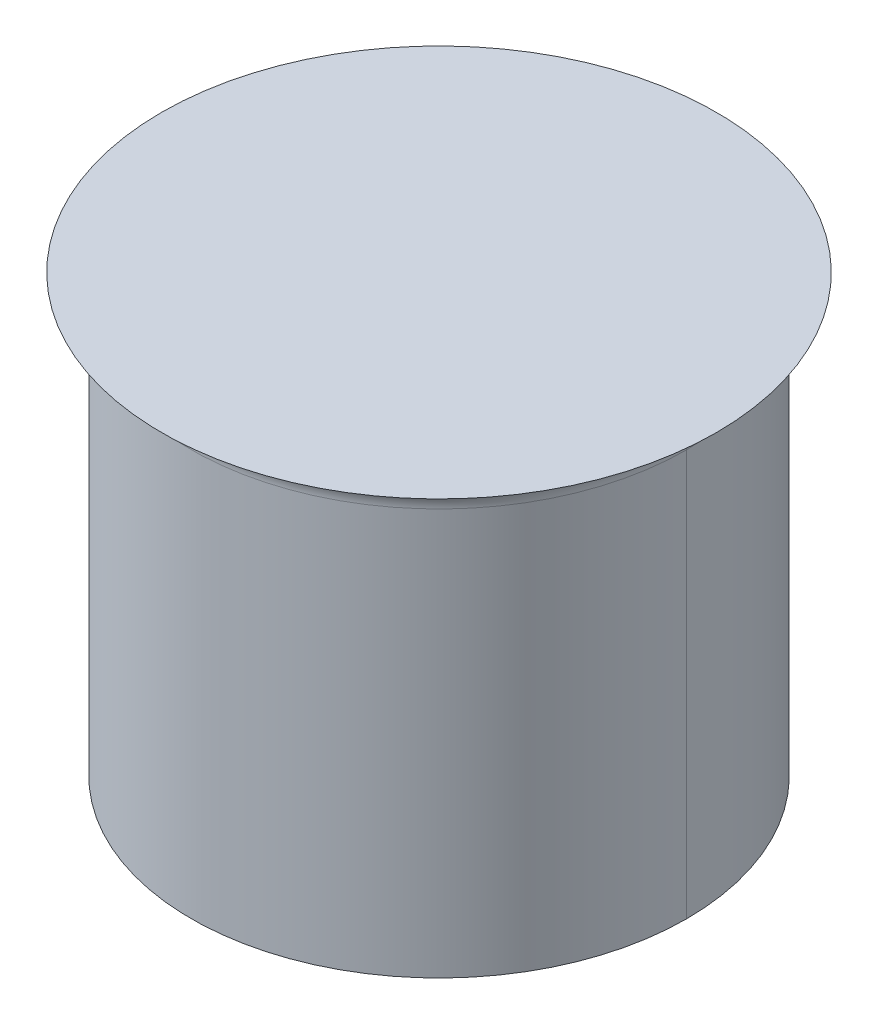
ISO-10303-21;
HEADER;
FILE_DESCRIPTION(('STEP AP214'),'2;1');
FILE_NAME('part.step','',(''),(''),'','','');
FILE_SCHEMA(('AUTOMOTIVE_DESIGN { 1 0 10303 214 1 1 1 1 }'));
ENDSEC;
DATA;
#1=APPLICATION_CONTEXT('core data for automotive mechanical design processes');
#2=APPLICATION_PROTOCOL_DEFINITION('international standard','automotive_design',2000,#1);
#3=PRODUCT_CONTEXT('',#1,'mechanical');
#4=PRODUCT('Part','Part','',(#3));
#5=PRODUCT_RELATED_PRODUCT_CATEGORY('part','',(#4));
#6=PRODUCT_DEFINITION_FORMATION('','',#4);
#7=PRODUCT_DEFINITION_CONTEXT('part definition',#1,'design');
#8=PRODUCT_DEFINITION('design','',#6,#7);
#9=PRODUCT_DEFINITION_SHAPE('','',#8);
#10=(LENGTH_UNIT() NAMED_UNIT(*) SI_UNIT(.MILLI.,.METRE.));
#11=(NAMED_UNIT(*) PLANE_ANGLE_UNIT() SI_UNIT($,.RADIAN.));
#12=(NAMED_UNIT(*) SI_UNIT($,.STERADIAN.) SOLID_ANGLE_UNIT());
#13=UNCERTAINTY_MEASURE_WITH_UNIT(LENGTH_MEASURE(1.E-05),#10,'distance_accuracy_value','');
#14=(GEOMETRIC_REPRESENTATION_CONTEXT(3) GLOBAL_UNCERTAINTY_ASSIGNED_CONTEXT((#13)) GLOBAL_UNIT_ASSIGNED_CONTEXT((#10,
#11,#12)) REPRESENTATION_CONTEXT('',''));
#15=CARTESIAN_POINT('',(0.,0.,0.));
#16=DIRECTION('',(0.,0.,1.));
#17=DIRECTION('',(1.,0.,0.));
#18=AXIS2_PLACEMENT_3D('',#15,#16,#17);
#19=CARTESIAN_POINT('',(0.,-53.3399999999998,0.));
#20=DIRECTION('',(0.,1.,0.));
#21=DIRECTION('',(1.,0.,0.));
#22=AXIS2_PLACEMENT_3D('',#19,#20,#21);
#23=CYLINDRICAL_SURFACE('',#22,12.7);
#24=DIRECTION('',(0.,1.,0.));
#25=VECTOR('',#24,1.);
#26=CARTESIAN_POINT('',(-12.7,-31.1149999999998,0.));
#27=LINE('',#26,#25);
#28=CARTESIAN_POINT('',(-12.7,-22.3519999999998,0.));
#29=VERTEX_POINT('',#28);
#30=CARTESIAN_POINT('',(-12.7,-1.524,0.));
#31=VERTEX_POINT('',#30);
#32=EDGE_CURVE('E61',#29,#31,#27,.T.);
#33=ORIENTED_EDGE('',*,*,#32,.F.);
#34=CARTESIAN_POINT('',(0.,-22.3519999999998,0.));
#35=DIRECTION('',(0.,-1.,0.));
#36=DIRECTION('',(0.,0.,-1.));
#37=AXIS2_PLACEMENT_3D('',#34,#35,#36);
#38=CIRCLE('',#37,12.7);
#39=CARTESIAN_POINT('',(12.7,-22.3519999999998,0.));
#40=VERTEX_POINT('',#39);
#41=EDGE_CURVE('E55',#29,#40,#38,.F.);
#42=ORIENTED_EDGE('',*,*,#41,.T.);
#43=DIRECTION('',(0.,1.,0.));
#44=VECTOR('',#43,1.);
#45=CARTESIAN_POINT('',(12.7,-31.1149999999998,0.));
#46=LINE('',#45,#44);
#47=CARTESIAN_POINT('',(12.7,-1.524,0.));
#48=VERTEX_POINT('',#47);
#49=EDGE_CURVE('E49',#40,#48,#46,.T.);
#50=ORIENTED_EDGE('',*,*,#49,.T.);
#51=CARTESIAN_POINT('',(0.,-1.52399999999998,0.));
#52=DIRECTION('',(0.,-1.,0.));
#53=DIRECTION('',(1.,0.,0.));
#54=AXIS2_PLACEMENT_3D('',#51,#52,#53);
#55=CIRCLE('',#54,12.7);
#56=EDGE_CURVE('E95',#48,#31,#55,.T.);
#57=ORIENTED_EDGE('',*,*,#56,.T.);
#58=EDGE_LOOP('',(#33,#42,#50,#57));
#59=FACE_BOUND('',#58,.T.);
#60=ADVANCED_FACE('F41',(#59),#23,.T.);
#61=CARTESIAN_POINT('',(0.,-53.3399999999998,0.));
#62=DIRECTION('',(0.,1.,0.));
#63=DIRECTION('',(1.,0.,0.));
#64=AXIS2_PLACEMENT_3D('',#61,#62,#63);
#65=CYLINDRICAL_SURFACE('',#64,12.7);
#66=ORIENTED_EDGE('',*,*,#49,.F.);
#67=CARTESIAN_POINT('',(0.,-22.3519999999998,0.));
#68=DIRECTION('',(0.,-1.,0.));
#69=DIRECTION('',(0.,0.,-1.));
#70=AXIS2_PLACEMENT_3D('',#67,#68,#69);
#71=CIRCLE('',#70,12.7);
#72=EDGE_CURVE('E11',#40,#29,#71,.F.);
#73=ORIENTED_EDGE('',*,*,#72,.T.);
#74=ORIENTED_EDGE('',*,*,#32,.T.);
#75=CARTESIAN_POINT('',(0.,-1.52399999999998,0.));
#76=DIRECTION('',(0.,-1.,0.));
#77=DIRECTION('',(-1.,0.,0.));
#78=AXIS2_PLACEMENT_3D('',#75,#76,#77);
#79=CIRCLE('',#78,12.7);
#80=EDGE_CURVE('E103',#31,#48,#79,.T.);
#81=ORIENTED_EDGE('',*,*,#80,.T.);
#82=EDGE_LOOP('',(#66,#73,#74,#81));
#83=FACE_BOUND('',#82,.T.);
#84=ADVANCED_FACE('F110',(#83),#65,.T.);
#85=CARTESIAN_POINT('',(0.,-1.524,0.));
#86=DIRECTION('',(0.,1.,0.));
#87=DIRECTION('',(-0.999730993496252,0.,0.0231935474431207));
#88=AXIS2_PLACEMENT_3D('',#85,#86,#87);
#89=TOROIDAL_SURFACE('',#88,14.224,1.524);
#90=CARTESIAN_POINT('',(14.224,-1.524,-4.29614026645209E-11));
#91=DIRECTION('',(3.02034786070493E-12,0.,1.));
#92=DIRECTION('',(-1.73358520597945E-12,1.,0.));
#93=AXIS2_PLACEMENT_3D('',#90,#91,#92);
#94=CIRCLE('',#93,1.524);
#95=CARTESIAN_POINT('',(14.224,0.,-4.29614026645249E-11));
#96=VERTEX_POINT('',#95);
#97=EDGE_CURVE('E89',#96,#48,#94,.T.);
#98=ORIENTED_EDGE('',*,*,#97,.T.);
#99=ORIENTED_EDGE('',*,*,#80,.F.);
#100=CARTESIAN_POINT('',(-14.224,-1.524,4.29579874276775E-11));
#101=DIRECTION('',(-3.02010846886525E-12,0.,-1.));
#102=DIRECTION('',(1.73244693598209E-12,1.,0.));
#103=AXIS2_PLACEMENT_3D('',#100,#101,#102);
#104=CIRCLE('',#103,1.524);
#105=CARTESIAN_POINT('',(-14.2239999999988,0.,0.));
#106=VERTEX_POINT('',#105);
#107=EDGE_CURVE('E91',#106,#31,#104,.T.);
#108=ORIENTED_EDGE('',*,*,#107,.F.);
#109=CARTESIAN_POINT('',(0.,0.,0.));
#110=DIRECTION('',(0.,-1.,0.));
#111=DIRECTION('',(-1.,0.,0.));
#112=AXIS2_PLACEMENT_3D('',#109,#110,#111);
#113=CIRCLE('',#112,14.224);
#114=EDGE_CURVE('E78',#106,#96,#113,.T.);
#115=ORIENTED_EDGE('',*,*,#114,.T.);
#116=EDGE_LOOP('',(#98,#99,#108,#115));
#117=FACE_BOUND('',#116,.T.);
#118=ADVANCED_FACE('F87',(#117),#89,.F.);
#119=CARTESIAN_POINT('',(0.,-1.524,0.));
#120=DIRECTION('',(0.,1.,0.));
#121=DIRECTION('',(0.999730993496252,0.,-0.0231935474431207));
#122=AXIS2_PLACEMENT_3D('',#119,#120,#121);
#123=TOROIDAL_SURFACE('',#122,14.224,1.524);
#124=ORIENTED_EDGE('',*,*,#107,.T.);
#125=ORIENTED_EDGE('',*,*,#56,.F.);
#126=ORIENTED_EDGE('',*,*,#97,.F.);
#127=CARTESIAN_POINT('',(0.,0.,0.));
#128=DIRECTION('',(0.,-1.,0.));
#129=DIRECTION('',(1.,0.,0.));
#130=AXIS2_PLACEMENT_3D('',#127,#128,#129);
#131=CIRCLE('',#130,14.224);
#132=EDGE_CURVE('E75',#96,#106,#131,.T.);
#133=ORIENTED_EDGE('',*,*,#132,.T.);
#134=EDGE_LOOP('',(#124,#125,#126,#133));
#135=FACE_BOUND('',#134,.T.);
#136=ADVANCED_FACE('F94',(#135),#123,.F.);
#137=CARTESIAN_POINT('',(-0.0231035448905459,-22.3519999999998,0.147203785957117));
#138=DIRECTION('',(0.,-1.,0.));
#139=DIRECTION('',(0.,0.,-1.));
#140=AXIS2_PLACEMENT_3D('',#137,#138,#139);
#141=PLANE('',#140);
#142=ORIENTED_EDGE('',*,*,#72,.F.);
#143=ORIENTED_EDGE('',*,*,#41,.F.);
#144=EDGE_LOOP('',(#142,#143));
#145=FACE_BOUND('',#144,.T.);
#146=ADVANCED_FACE('F120',(#145),#141,.T.);
#147=CARTESIAN_POINT('',(0.,0.,0.));
#148=DIRECTION('',(0.,-1.,0.));
#149=DIRECTION('',(0.,0.,-1.));
#150=AXIS2_PLACEMENT_3D('',#147,#148,#149);
#151=PLANE('',#150);
#152=ORIENTED_EDGE('',*,*,#132,.F.);
#153=ORIENTED_EDGE('',*,*,#114,.F.);
#154=EDGE_LOOP('',(#152,#153));
#155=FACE_BOUND('',#154,.T.);
#156=ADVANCED_FACE('F77',(#155),#151,.F.);
#157=CLOSED_SHELL('',(#60,#84,#118,#136,#146,#156));
#158=MANIFOLD_SOLID_BREP('B2',#157);
#159=ADVANCED_BREP_SHAPE_REPRESENTATION('',(#18,#158),#14);
#160=SHAPE_DEFINITION_REPRESENTATION(#9,#159);
ENDSEC;
END-ISO-10303-21;
